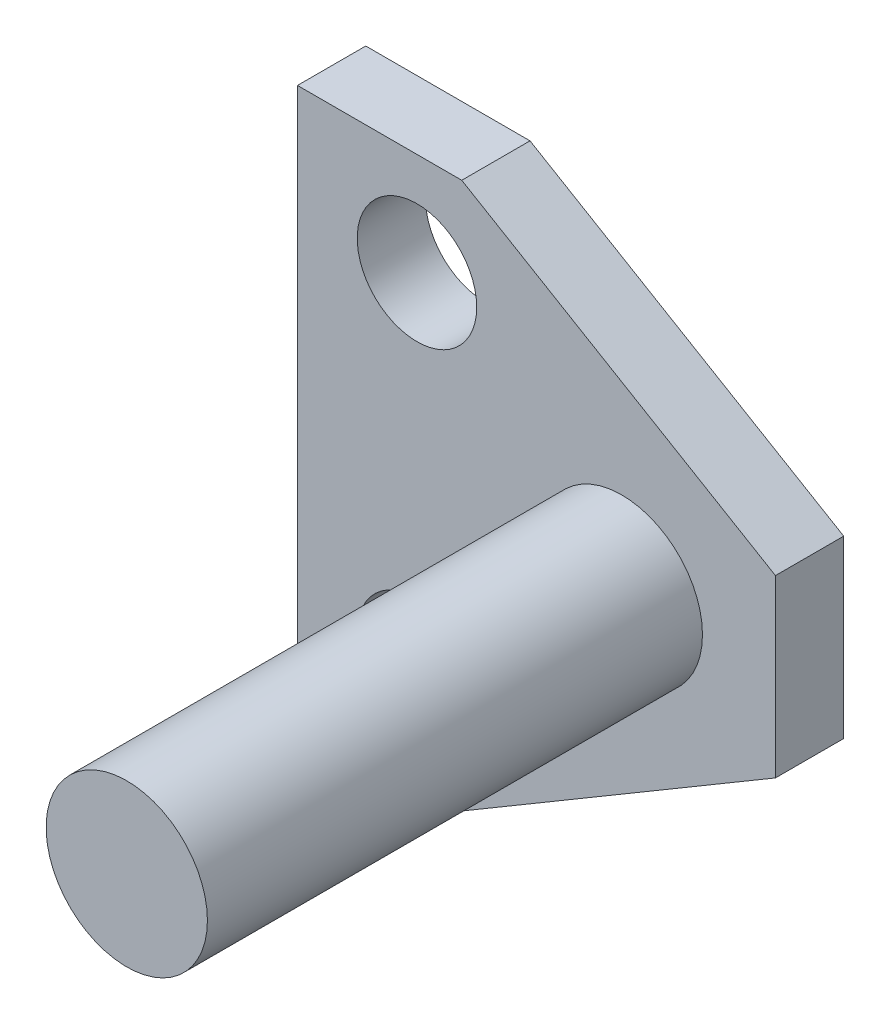
ISO-10303-21;
HEADER;
FILE_DESCRIPTION(('STEP AP214'),'2;1');
FILE_NAME('part.step','',(''),(''),'','','');
FILE_SCHEMA(('AUTOMOTIVE_DESIGN { 1 0 10303 214 1 1 1 1 }'));
ENDSEC;
DATA;
#1=APPLICATION_CONTEXT('core data for automotive mechanical design processes');
#2=APPLICATION_PROTOCOL_DEFINITION('international standard','automotive_design',2000,#1);
#3=PRODUCT_CONTEXT('',#1,'mechanical');
#4=PRODUCT('Part','Part','',(#3));
#5=PRODUCT_RELATED_PRODUCT_CATEGORY('part','',(#4));
#6=PRODUCT_DEFINITION_FORMATION('','',#4);
#7=PRODUCT_DEFINITION_CONTEXT('part definition',#1,'design');
#8=PRODUCT_DEFINITION('design','',#6,#7);
#9=PRODUCT_DEFINITION_SHAPE('','',#8);
#10=(LENGTH_UNIT() NAMED_UNIT(*) SI_UNIT(.MILLI.,.METRE.));
#11=(NAMED_UNIT(*) PLANE_ANGLE_UNIT() SI_UNIT($,.RADIAN.));
#12=(NAMED_UNIT(*) SI_UNIT($,.STERADIAN.) SOLID_ANGLE_UNIT());
#13=UNCERTAINTY_MEASURE_WITH_UNIT(LENGTH_MEASURE(1.E-05),#10,'distance_accuracy_value','');
#14=(GEOMETRIC_REPRESENTATION_CONTEXT(3) GLOBAL_UNCERTAINTY_ASSIGNED_CONTEXT((#13)) GLOBAL_UNIT_ASSIGNED_CONTEXT((#10,
#11,#12)) REPRESENTATION_CONTEXT('',''));
#15=CARTESIAN_POINT('',(0.,0.,0.));
#16=DIRECTION('',(0.,0.,1.));
#17=DIRECTION('',(1.,0.,0.));
#18=AXIS2_PLACEMENT_3D('',#15,#16,#17);
#19=CARTESIAN_POINT('',(0.,0.,2.));
#20=DIRECTION('',(0.,0.,-1.));
#21=DIRECTION('',(-1.,0.,0.));
#22=AXIS2_PLACEMENT_3D('',#19,#20,#21);
#23=PLANE('',#22);
#24=DIRECTION('',(1.,0.,0.));
#25=VECTOR('',#24,1.);
#26=CARTESIAN_POINT('',(-4.6882282813042,-8.,2.));
#27=LINE('',#26,#25);
#28=CARTESIAN_POINT('',(-9.5,-8.,2.));
#29=VERTEX_POINT('',#28);
#30=CARTESIAN_POINT('',(-4.6882282813042,-8.,2.));
#31=VERTEX_POINT('',#30);
#32=EDGE_CURVE('E130',#29,#31,#27,.T.);
#33=ORIENTED_EDGE('',*,*,#32,.T.);
#34=DIRECTION('',(0.860777571070948,0.50898130922579,0.));
#35=VECTOR('',#34,1.);
#36=CARTESIAN_POINT('',(4.5,-2.56696292136755,2.));
#37=LINE('',#36,#35);
#38=CARTESIAN_POINT('',(4.5,-2.56696292136755,2.));
#39=VERTEX_POINT('',#38);
#40=EDGE_CURVE('E88',#31,#39,#37,.T.);
#41=ORIENTED_EDGE('',*,*,#40,.T.);
#42=DIRECTION('',(0.,1.,0.));
#43=VECTOR('',#42,1.);
#44=CARTESIAN_POINT('',(4.5,2.56696292136755,2.));
#45=LINE('',#44,#43);
#46=CARTESIAN_POINT('',(4.5,2.56696292136755,2.));
#47=VERTEX_POINT('',#46);
#48=EDGE_CURVE('E101',#39,#47,#45,.T.);
#49=ORIENTED_EDGE('',*,*,#48,.T.);
#50=DIRECTION('',(-0.860777571070948,0.50898130922579,0.));
#51=VECTOR('',#50,1.);
#52=CARTESIAN_POINT('',(-4.6882282813042,8.,2.));
#53=LINE('',#52,#51);
#54=CARTESIAN_POINT('',(-4.6882282813042,8.,2.));
#55=VERTEX_POINT('',#54);
#56=EDGE_CURVE('E95',#47,#55,#53,.T.);
#57=ORIENTED_EDGE('',*,*,#56,.T.);
#58=DIRECTION('',(-1.,0.,0.));
#59=VECTOR('',#58,1.);
#60=CARTESIAN_POINT('',(-9.50000000000001,8.,2.));
#61=LINE('',#60,#59);
#62=CARTESIAN_POINT('',(-9.50000000000001,8.,2.));
#63=VERTEX_POINT('',#62);
#64=EDGE_CURVE('E99',#55,#63,#61,.T.);
#65=ORIENTED_EDGE('',*,*,#64,.T.);
#66=DIRECTION('',(0.,-1.,0.));
#67=VECTOR('',#66,1.);
#68=CARTESIAN_POINT('',(-9.5,-8.,2.));
#69=LINE('',#68,#67);
#70=EDGE_CURVE('E51',#63,#29,#69,.T.);
#71=ORIENTED_EDGE('',*,*,#70,.T.);
#72=EDGE_LOOP('',(#33,#41,#49,#57,#65,#71));
#73=FACE_BOUND('',#72,.T.);
#74=CARTESIAN_POINT('',(-6.,-5.,2.));
#75=DIRECTION('',(0.,0.,1.));
#76=DIRECTION('',(1.,0.,0.));
#77=AXIS2_PLACEMENT_3D('',#74,#75,#76);
#78=CIRCLE('',#77,1.75);
#79=CARTESIAN_POINT('',(-4.25,-5.,2.));
#80=VERTEX_POINT('',#79);
#81=EDGE_CURVE('E123',#80,#80,#78,.T.);
#82=ORIENTED_EDGE('',*,*,#81,.F.);
#83=EDGE_LOOP('',(#82));
#84=FACE_BOUND('',#83,.T.);
#85=CARTESIAN_POINT('',(-6.,5.,2.));
#86=DIRECTION('',(0.,0.,1.));
#87=DIRECTION('',(1.,0.,0.));
#88=AXIS2_PLACEMENT_3D('',#85,#86,#87);
#89=CIRCLE('',#88,1.75);
#90=CARTESIAN_POINT('',(-4.25,5.,2.));
#91=VERTEX_POINT('',#90);
#92=EDGE_CURVE('E185',#91,#91,#89,.T.);
#93=ORIENTED_EDGE('',*,*,#92,.F.);
#94=EDGE_LOOP('',(#93));
#95=FACE_BOUND('',#94,.T.);
#96=CARTESIAN_POINT('',(0.,0.,2.));
#97=DIRECTION('',(0.,0.,1.));
#98=DIRECTION('',(1.,0.,0.));
#99=AXIS2_PLACEMENT_3D('',#96,#97,#98);
#100=CIRCLE('',#99,2.3625);
#101=CARTESIAN_POINT('',(2.3625,0.,2.));
#102=VERTEX_POINT('',#101);
#103=EDGE_CURVE('E179',#102,#102,#100,.T.);
#104=ORIENTED_EDGE('',*,*,#103,.F.);
#105=EDGE_LOOP('',(#104));
#106=FACE_BOUND('',#105,.T.);
#107=ADVANCED_FACE('F34',(#73,#84,#95,#106),#23,.F.);
#108=CARTESIAN_POINT('',(0.,0.,0.));
#109=DIRECTION('',(0.,0.,-1.));
#110=DIRECTION('',(-1.,0.,0.));
#111=AXIS2_PLACEMENT_3D('',#108,#109,#110);
#112=PLANE('',#111);
#113=CARTESIAN_POINT('',(-6.,5.,0.));
#114=DIRECTION('',(0.,0.,1.));
#115=DIRECTION('',(1.,0.,0.));
#116=AXIS2_PLACEMENT_3D('',#113,#114,#115);
#117=CIRCLE('',#116,1.75);
#118=CARTESIAN_POINT('',(-4.25,5.,0.));
#119=VERTEX_POINT('',#118);
#120=EDGE_CURVE('E182',#119,#119,#117,.T.);
#121=ORIENTED_EDGE('',*,*,#120,.T.);
#122=EDGE_LOOP('',(#121));
#123=FACE_BOUND('',#122,.T.);
#124=DIRECTION('',(1.,0.,0.));
#125=VECTOR('',#124,1.);
#126=CARTESIAN_POINT('',(-4.6882282813042,-8.,0.));
#127=LINE('',#126,#125);
#128=CARTESIAN_POINT('',(-9.5,-8.,0.));
#129=VERTEX_POINT('',#128);
#130=CARTESIAN_POINT('',(-4.6882282813042,-8.,0.));
#131=VERTEX_POINT('',#130);
#132=EDGE_CURVE('E119',#129,#131,#127,.T.);
#133=ORIENTED_EDGE('',*,*,#132,.F.);
#134=DIRECTION('',(0.,-1.,0.));
#135=VECTOR('',#134,1.);
#136=CARTESIAN_POINT('',(-9.5,-8.,0.));
#137=LINE('',#136,#135);
#138=CARTESIAN_POINT('',(-9.50000000000001,8.,0.));
#139=VERTEX_POINT('',#138);
#140=EDGE_CURVE('E80',#139,#129,#137,.T.);
#141=ORIENTED_EDGE('',*,*,#140,.F.);
#142=DIRECTION('',(-1.,0.,0.));
#143=VECTOR('',#142,1.);
#144=CARTESIAN_POINT('',(-9.50000000000001,8.,0.));
#145=LINE('',#144,#143);
#146=CARTESIAN_POINT('',(-4.6882282813042,8.,0.));
#147=VERTEX_POINT('',#146);
#148=EDGE_CURVE('E74',#147,#139,#145,.T.);
#149=ORIENTED_EDGE('',*,*,#148,.F.);
#150=DIRECTION('',(-0.860777571070948,0.50898130922579,0.));
#151=VECTOR('',#150,1.);
#152=CARTESIAN_POINT('',(-4.6882282813042,8.,0.));
#153=LINE('',#152,#151);
#154=CARTESIAN_POINT('',(4.5,2.56696292136755,0.));
#155=VERTEX_POINT('',#154);
#156=EDGE_CURVE('E109',#155,#147,#153,.T.);
#157=ORIENTED_EDGE('',*,*,#156,.F.);
#158=DIRECTION('',(0.,1.,0.));
#159=VECTOR('',#158,1.);
#160=CARTESIAN_POINT('',(4.5,2.56696292136755,0.));
#161=LINE('',#160,#159);
#162=CARTESIAN_POINT('',(4.5,-2.56696292136755,0.));
#163=VERTEX_POINT('',#162);
#164=EDGE_CURVE('E125',#163,#155,#161,.T.);
#165=ORIENTED_EDGE('',*,*,#164,.F.);
#166=DIRECTION('',(0.860777571070948,0.50898130922579,0.));
#167=VECTOR('',#166,1.);
#168=CARTESIAN_POINT('',(4.5,-2.56696292136755,0.));
#169=LINE('',#168,#167);
#170=EDGE_CURVE('E122',#131,#163,#169,.T.);
#171=ORIENTED_EDGE('',*,*,#170,.F.);
#172=EDGE_LOOP('',(#133,#141,#149,#157,#165,#171));
#173=FACE_BOUND('',#172,.T.);
#174=CARTESIAN_POINT('',(-6.,-5.,0.));
#175=DIRECTION('',(0.,0.,1.));
#176=DIRECTION('',(1.,0.,0.));
#177=AXIS2_PLACEMENT_3D('',#174,#175,#176);
#178=CIRCLE('',#177,1.75);
#179=CARTESIAN_POINT('',(-4.25,-5.,0.));
#180=VERTEX_POINT('',#179);
#181=EDGE_CURVE('E188',#180,#180,#178,.T.);
#182=ORIENTED_EDGE('',*,*,#181,.T.);
#183=EDGE_LOOP('',(#182));
#184=FACE_BOUND('',#183,.T.);
#185=ADVANCED_FACE('F139',(#123,#173,#184),#112,.T.);
#186=CARTESIAN_POINT('',(-4.6882282813042,-8.,2.));
#187=DIRECTION('',(0.,1.,0.));
#188=DIRECTION('',(-1.,0.,0.));
#189=AXIS2_PLACEMENT_3D('',#186,#187,#188);
#190=PLANE('',#189);
#191=ORIENTED_EDGE('',*,*,#132,.T.);
#192=DIRECTION('',(0.,0.,-1.));
#193=VECTOR('',#192,1.);
#194=CARTESIAN_POINT('',(-4.6882282813042,-8.,2.));
#195=LINE('',#194,#193);
#196=EDGE_CURVE('E11',#31,#131,#195,.T.);
#197=ORIENTED_EDGE('',*,*,#196,.F.);
#198=ORIENTED_EDGE('',*,*,#32,.F.);
#199=DIRECTION('',(0.,0.,-1.));
#200=VECTOR('',#199,1.);
#201=CARTESIAN_POINT('',(-9.5,-8.,2.));
#202=LINE('',#201,#200);
#203=EDGE_CURVE('E115',#29,#129,#202,.T.);
#204=ORIENTED_EDGE('',*,*,#203,.T.);
#205=EDGE_LOOP('',(#191,#197,#198,#204));
#206=FACE_BOUND('',#205,.T.);
#207=ADVANCED_FACE('F36',(#206),#190,.F.);
#208=CARTESIAN_POINT('',(4.5,-2.56696292136755,2.));
#209=DIRECTION('',(-0.50898130922579,0.860777571070948,0.));
#210=DIRECTION('',(-0.860777571070948,-0.50898130922579,0.));
#211=AXIS2_PLACEMENT_3D('',#208,#209,#210);
#212=PLANE('',#211);
#213=ORIENTED_EDGE('',*,*,#170,.T.);
#214=DIRECTION('',(0.,0.,-1.));
#215=VECTOR('',#214,1.);
#216=CARTESIAN_POINT('',(4.5,-2.56696292136755,2.));
#217=LINE('',#216,#215);
#218=EDGE_CURVE('E43',#39,#163,#217,.T.);
#219=ORIENTED_EDGE('',*,*,#218,.F.);
#220=ORIENTED_EDGE('',*,*,#40,.F.);
#221=ORIENTED_EDGE('',*,*,#196,.T.);
#222=EDGE_LOOP('',(#213,#219,#220,#221));
#223=FACE_BOUND('',#222,.T.);
#224=ADVANCED_FACE('F246',(#223),#212,.F.);
#225=CARTESIAN_POINT('',(4.5,2.56696292136755,2.));
#226=DIRECTION('',(-1.,0.,0.));
#227=DIRECTION('',(0.,-1.,0.));
#228=AXIS2_PLACEMENT_3D('',#225,#226,#227);
#229=PLANE('',#228);
#230=ORIENTED_EDGE('',*,*,#164,.T.);
#231=DIRECTION('',(0.,0.,-1.));
#232=VECTOR('',#231,1.);
#233=CARTESIAN_POINT('',(4.5,2.56696292136755,2.));
#234=LINE('',#233,#232);
#235=EDGE_CURVE('E110',#47,#155,#234,.T.);
#236=ORIENTED_EDGE('',*,*,#235,.F.);
#237=ORIENTED_EDGE('',*,*,#48,.F.);
#238=ORIENTED_EDGE('',*,*,#218,.T.);
#239=EDGE_LOOP('',(#230,#236,#237,#238));
#240=FACE_BOUND('',#239,.T.);
#241=ADVANCED_FACE('F136',(#240),#229,.F.);
#242=CARTESIAN_POINT('',(-4.6882282813042,8.,2.));
#243=DIRECTION('',(-0.50898130922579,-0.860777571070948,0.));
#244=DIRECTION('',(0.860777571070948,-0.50898130922579,0.));
#245=AXIS2_PLACEMENT_3D('',#242,#243,#244);
#246=PLANE('',#245);
#247=ORIENTED_EDGE('',*,*,#156,.T.);
#248=DIRECTION('',(0.,0.,-1.));
#249=VECTOR('',#248,1.);
#250=CARTESIAN_POINT('',(-4.6882282813042,8.,2.));
#251=LINE('',#250,#249);
#252=EDGE_CURVE('E106',#55,#147,#251,.T.);
#253=ORIENTED_EDGE('',*,*,#252,.F.);
#254=ORIENTED_EDGE('',*,*,#56,.F.);
#255=ORIENTED_EDGE('',*,*,#235,.T.);
#256=EDGE_LOOP('',(#247,#253,#254,#255));
#257=FACE_BOUND('',#256,.T.);
#258=ADVANCED_FACE('F107',(#257),#246,.F.);
#259=CARTESIAN_POINT('',(-9.50000000000001,8.,2.));
#260=DIRECTION('',(0.,-1.,0.));
#261=DIRECTION('',(0.,0.,-1.));
#262=AXIS2_PLACEMENT_3D('',#259,#260,#261);
#263=PLANE('',#262);
#264=ORIENTED_EDGE('',*,*,#148,.T.);
#265=DIRECTION('',(0.,0.,-1.));
#266=VECTOR('',#265,1.);
#267=CARTESIAN_POINT('',(-9.50000000000001,8.,2.));
#268=LINE('',#267,#266);
#269=EDGE_CURVE('E111',#63,#139,#268,.T.);
#270=ORIENTED_EDGE('',*,*,#269,.F.);
#271=ORIENTED_EDGE('',*,*,#64,.F.);
#272=ORIENTED_EDGE('',*,*,#252,.T.);
#273=EDGE_LOOP('',(#264,#270,#271,#272));
#274=FACE_BOUND('',#273,.T.);
#275=ADVANCED_FACE('F113',(#274),#263,.F.);
#276=CARTESIAN_POINT('',(-9.5,-8.,2.));
#277=DIRECTION('',(1.,0.,0.));
#278=DIRECTION('',(0.,1.,0.));
#279=AXIS2_PLACEMENT_3D('',#276,#277,#278);
#280=PLANE('',#279);
#281=ORIENTED_EDGE('',*,*,#140,.T.);
#282=ORIENTED_EDGE('',*,*,#203,.F.);
#283=ORIENTED_EDGE('',*,*,#70,.F.);
#284=ORIENTED_EDGE('',*,*,#269,.T.);
#285=EDGE_LOOP('',(#281,#282,#283,#284));
#286=FACE_BOUND('',#285,.T.);
#287=ADVANCED_FACE('F144',(#286),#280,.F.);
#288=CARTESIAN_POINT('',(-6.,-5.,2.));
#289=DIRECTION('',(0.,0.,-1.));
#290=DIRECTION('',(-1.,0.,0.));
#291=AXIS2_PLACEMENT_3D('',#288,#289,#290);
#292=CYLINDRICAL_SURFACE('',#291,1.75);
#293=ORIENTED_EDGE('',*,*,#81,.T.);
#294=EDGE_LOOP('',(#293));
#295=FACE_BOUND('',#294,.T.);
#296=ORIENTED_EDGE('',*,*,#181,.F.);
#297=EDGE_LOOP('',(#296));
#298=FACE_BOUND('',#297,.T.);
#299=ADVANCED_FACE('F146',(#295,#298),#292,.F.);
#300=CARTESIAN_POINT('',(-6.,5.,2.));
#301=DIRECTION('',(0.,0.,-1.));
#302=DIRECTION('',(-1.,0.,0.));
#303=AXIS2_PLACEMENT_3D('',#300,#301,#302);
#304=CYLINDRICAL_SURFACE('',#303,1.75);
#305=ORIENTED_EDGE('',*,*,#92,.T.);
#306=EDGE_LOOP('',(#305));
#307=FACE_BOUND('',#306,.T.);
#308=ORIENTED_EDGE('',*,*,#120,.F.);
#309=EDGE_LOOP('',(#308));
#310=FACE_BOUND('',#309,.T.);
#311=ADVANCED_FACE('F152',(#307,#310),#304,.F.);
#312=CARTESIAN_POINT('',(0.,0.,16.5));
#313=DIRECTION('',(0.,0.,-1.));
#314=DIRECTION('',(-1.,0.,0.));
#315=AXIS2_PLACEMENT_3D('',#312,#313,#314);
#316=CYLINDRICAL_SURFACE('',#315,2.3625);
#317=CARTESIAN_POINT('',(0.,0.,16.5));
#318=DIRECTION('',(0.,0.,1.));
#319=DIRECTION('',(1.,0.,0.));
#320=AXIS2_PLACEMENT_3D('',#317,#318,#319);
#321=CIRCLE('',#320,2.3625);
#322=CARTESIAN_POINT('',(2.3625,0.,16.5));
#323=VERTEX_POINT('',#322);
#324=EDGE_CURVE('E178',#323,#323,#321,.T.);
#325=ORIENTED_EDGE('',*,*,#324,.F.);
#326=EDGE_LOOP('',(#325));
#327=FACE_BOUND('',#326,.T.);
#328=ORIENTED_EDGE('',*,*,#103,.T.);
#329=EDGE_LOOP('',(#328));
#330=FACE_BOUND('',#329,.T.);
#331=ADVANCED_FACE('F166',(#327,#330),#316,.T.);
#332=CARTESIAN_POINT('',(0.,0.,16.5));
#333=DIRECTION('',(0.,0.,1.));
#334=DIRECTION('',(1.,0.,0.));
#335=AXIS2_PLACEMENT_3D('',#332,#333,#334);
#336=PLANE('',#335);
#337=ORIENTED_EDGE('',*,*,#324,.T.);
#338=EDGE_LOOP('',(#337));
#339=FACE_BOUND('',#338,.T.);
#340=ADVANCED_FACE('F170',(#339),#336,.T.);
#341=CLOSED_SHELL('',(#107,#185,#207,#224,#241,#258,#275,#287,#299,#311,#331,#340));
#342=MANIFOLD_SOLID_BREP('B2',#341);
#343=ADVANCED_BREP_SHAPE_REPRESENTATION('',(#18,#342),#14);
#344=SHAPE_DEFINITION_REPRESENTATION(#9,#343);
ENDSEC;
END-ISO-10303-21;
